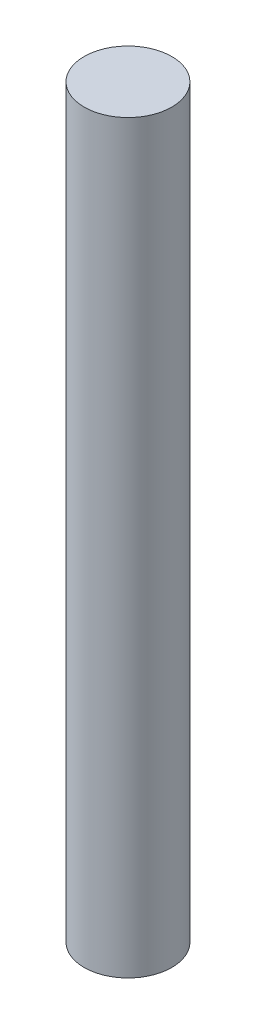
ISO-10303-21;
HEADER;
FILE_DESCRIPTION(('STEP AP214'),'2;1');
FILE_NAME('part.step','',(''),(''),'','','');
FILE_SCHEMA(('AUTOMOTIVE_DESIGN { 1 0 10303 214 1 1 1 1 }'));
ENDSEC;
DATA;
#1=APPLICATION_CONTEXT('core data for automotive mechanical design processes');
#2=APPLICATION_PROTOCOL_DEFINITION('international standard','automotive_design',2000,#1);
#3=PRODUCT_CONTEXT('',#1,'mechanical');
#4=PRODUCT('Part','Part','',(#3));
#5=PRODUCT_RELATED_PRODUCT_CATEGORY('part','',(#4));
#6=PRODUCT_DEFINITION_FORMATION('','',#4);
#7=PRODUCT_DEFINITION_CONTEXT('part definition',#1,'design');
#8=PRODUCT_DEFINITION('design','',#6,#7);
#9=PRODUCT_DEFINITION_SHAPE('','',#8);
#10=(LENGTH_UNIT() NAMED_UNIT(*) SI_UNIT(.MILLI.,.METRE.));
#11=(NAMED_UNIT(*) PLANE_ANGLE_UNIT() SI_UNIT($,.RADIAN.));
#12=(NAMED_UNIT(*) SI_UNIT($,.STERADIAN.) SOLID_ANGLE_UNIT());
#13=UNCERTAINTY_MEASURE_WITH_UNIT(LENGTH_MEASURE(1.E-05),#10,'distance_accuracy_value','');
#14=(GEOMETRIC_REPRESENTATION_CONTEXT(3) GLOBAL_UNCERTAINTY_ASSIGNED_CONTEXT((#13)) GLOBAL_UNIT_ASSIGNED_CONTEXT((#10,
#11,#12)) REPRESENTATION_CONTEXT('',''));
#15=CARTESIAN_POINT('',(0.,0.,0.));
#16=DIRECTION('',(0.,0.,1.));
#17=DIRECTION('',(1.,0.,0.));
#18=AXIS2_PLACEMENT_3D('',#15,#16,#17);
#19=CARTESIAN_POINT('',(0.,25.5,0.));
#20=DIRECTION('',(0.,-1.,0.));
#21=DIRECTION('',(0.,0.,-1.));
#22=AXIS2_PLACEMENT_3D('',#19,#20,#21);
#23=CYLINDRICAL_SURFACE('',#22,1.5);
#24=CARTESIAN_POINT('',(0.,25.5,0.));
#25=DIRECTION('',(0.,1.,0.));
#26=DIRECTION('',(0.,0.,1.));
#27=AXIS2_PLACEMENT_3D('',#24,#25,#26);
#28=CIRCLE('',#27,1.5);
#29=CARTESIAN_POINT('',(0.,25.5,1.5));
#30=VERTEX_POINT('',#29);
#31=EDGE_CURVE('E10',#30,#30,#28,.T.);
#32=ORIENTED_EDGE('',*,*,#31,.F.);
#33=EDGE_LOOP('',(#32));
#34=FACE_BOUND('',#33,.T.);
#35=CARTESIAN_POINT('',(0.,0.,0.));
#36=DIRECTION('',(0.,1.,0.));
#37=DIRECTION('',(0.,0.,1.));
#38=AXIS2_PLACEMENT_3D('',#35,#36,#37);
#39=CIRCLE('',#38,1.5);
#40=CARTESIAN_POINT('',(0.,0.,1.5));
#41=VERTEX_POINT('',#40);
#42=EDGE_CURVE('E33',#41,#41,#39,.T.);
#43=ORIENTED_EDGE('',*,*,#42,.T.);
#44=EDGE_LOOP('',(#43));
#45=FACE_BOUND('',#44,.T.);
#46=ADVANCED_FACE('F30',(#34,#45),#23,.T.);
#47=CARTESIAN_POINT('',(0.,25.5,0.));
#48=DIRECTION('',(0.,1.,0.));
#49=DIRECTION('',(0.,0.,1.));
#50=AXIS2_PLACEMENT_3D('',#47,#48,#49);
#51=PLANE('',#50);
#52=ORIENTED_EDGE('',*,*,#31,.T.);
#53=EDGE_LOOP('',(#52));
#54=FACE_BOUND('',#53,.T.);
#55=ADVANCED_FACE('F45',(#54),#51,.T.);
#56=CARTESIAN_POINT('',(0.,0.,0.));
#57=DIRECTION('',(0.,1.,0.));
#58=DIRECTION('',(0.,0.,1.));
#59=AXIS2_PLACEMENT_3D('',#56,#57,#58);
#60=PLANE('',#59);
#61=ORIENTED_EDGE('',*,*,#42,.F.);
#62=EDGE_LOOP('',(#61));
#63=FACE_BOUND('',#62,.T.);
#64=ADVANCED_FACE('F43',(#63),#60,.F.);
#65=CLOSED_SHELL('',(#46,#55,#64));
#66=MANIFOLD_SOLID_BREP('B2',#65);
#67=ADVANCED_BREP_SHAPE_REPRESENTATION('',(#18,#66),#14);
#68=SHAPE_DEFINITION_REPRESENTATION(#9,#67);
ENDSEC;
END-ISO-10303-21;
